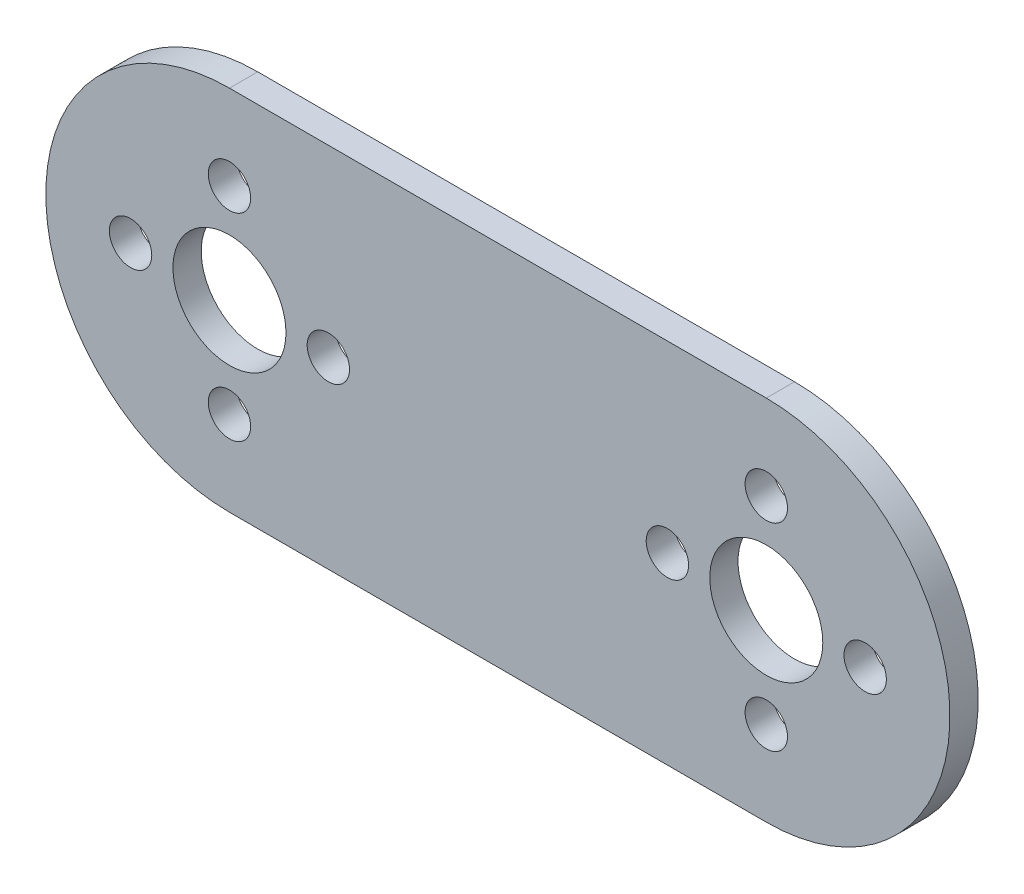
ISO-10303-21;
HEADER;
FILE_DESCRIPTION(('STEP AP214'),'2;1');
FILE_NAME('part.step','',(''),(''),'','','');
FILE_SCHEMA(('AUTOMOTIVE_DESIGN { 1 0 10303 214 1 1 1 1 }'));
ENDSEC;
DATA;
#1=APPLICATION_CONTEXT('core data for automotive mechanical design processes');
#2=APPLICATION_PROTOCOL_DEFINITION('international standard','automotive_design',2000,#1);
#3=PRODUCT_CONTEXT('',#1,'mechanical');
#4=PRODUCT('Part','Part','',(#3));
#5=PRODUCT_RELATED_PRODUCT_CATEGORY('part','',(#4));
#6=PRODUCT_DEFINITION_FORMATION('','',#4);
#7=PRODUCT_DEFINITION_CONTEXT('part definition',#1,'design');
#8=PRODUCT_DEFINITION('design','',#6,#7);
#9=PRODUCT_DEFINITION_SHAPE('','',#8);
#10=(LENGTH_UNIT() NAMED_UNIT(*) SI_UNIT(.MILLI.,.METRE.));
#11=(NAMED_UNIT(*) PLANE_ANGLE_UNIT() SI_UNIT($,.RADIAN.));
#12=(NAMED_UNIT(*) SI_UNIT($,.STERADIAN.) SOLID_ANGLE_UNIT());
#13=UNCERTAINTY_MEASURE_WITH_UNIT(LENGTH_MEASURE(1.E-05),#10,'distance_accuracy_value','');
#14=(GEOMETRIC_REPRESENTATION_CONTEXT(3) GLOBAL_UNCERTAINTY_ASSIGNED_CONTEXT((#13)) GLOBAL_UNIT_ASSIGNED_CONTEXT((#10,
#11,#12)) REPRESENTATION_CONTEXT('',''));
#15=CARTESIAN_POINT('',(0.,0.,0.));
#16=DIRECTION('',(0.,0.,1.));
#17=DIRECTION('',(1.,0.,0.));
#18=AXIS2_PLACEMENT_3D('',#15,#16,#17);
#19=CARTESIAN_POINT('',(19.,0.,2.));
#20=DIRECTION('',(0.,0.,-1.));
#21=DIRECTION('',(-1.,0.,0.));
#22=AXIS2_PLACEMENT_3D('',#19,#20,#21);
#23=PLANE('',#22);
#24=CARTESIAN_POINT('',(19.,0.,2.));
#25=DIRECTION('',(0.,0.,1.));
#26=DIRECTION('',(-1.,0.,0.));
#27=AXIS2_PLACEMENT_3D('',#24,#25,#26);
#28=CIRCLE('',#27,13.);
#29=CARTESIAN_POINT('',(19.,-13.,2.));
#30=VERTEX_POINT('',#29);
#31=CARTESIAN_POINT('',(19.,13.,2.));
#32=VERTEX_POINT('',#31);
#33=EDGE_CURVE('E92',#30,#32,#28,.T.);
#34=ORIENTED_EDGE('',*,*,#33,.T.);
#35=DIRECTION('',(-1.,0.,0.));
#36=VECTOR('',#35,1.);
#37=CARTESIAN_POINT('',(-19.,13.,2.));
#38=LINE('',#37,#36);
#39=CARTESIAN_POINT('',(-19.,13.,2.));
#40=VERTEX_POINT('',#39);
#41=EDGE_CURVE('E87',#32,#40,#38,.T.);
#42=ORIENTED_EDGE('',*,*,#41,.T.);
#43=CARTESIAN_POINT('',(-19.,0.,2.));
#44=DIRECTION('',(0.,0.,1.));
#45=DIRECTION('',(-1.,0.,0.));
#46=AXIS2_PLACEMENT_3D('',#43,#44,#45);
#47=CIRCLE('',#46,13.);
#48=CARTESIAN_POINT('',(-19.,-13.,2.));
#49=VERTEX_POINT('',#48);
#50=EDGE_CURVE('E90',#40,#49,#47,.T.);
#51=ORIENTED_EDGE('',*,*,#50,.T.);
#52=DIRECTION('',(1.,0.,0.));
#53=VECTOR('',#52,1.);
#54=CARTESIAN_POINT('',(-19.,-13.,2.));
#55=LINE('',#54,#53);
#56=EDGE_CURVE('E57',#49,#30,#55,.T.);
#57=ORIENTED_EDGE('',*,*,#56,.T.);
#58=EDGE_LOOP('',(#34,#42,#51,#57));
#59=FACE_BOUND('',#58,.T.);
#60=CARTESIAN_POINT('',(-19.,0.,2.));
#61=DIRECTION('',(0.,0.,1.));
#62=DIRECTION('',(1.,0.,0.));
#63=AXIS2_PLACEMENT_3D('',#60,#61,#62);
#64=CIRCLE('',#63,4.);
#65=CARTESIAN_POINT('',(-15.,0.,2.));
#66=VERTEX_POINT('',#65);
#67=EDGE_CURVE('E112',#66,#66,#64,.T.);
#68=ORIENTED_EDGE('',*,*,#67,.F.);
#69=EDGE_LOOP('',(#68));
#70=FACE_BOUND('',#69,.T.);
#71=CARTESIAN_POINT('',(19.,0.,2.));
#72=DIRECTION('',(0.,0.,1.));
#73=DIRECTION('',(1.,0.,0.));
#74=AXIS2_PLACEMENT_3D('',#71,#72,#73);
#75=CIRCLE('',#74,4.);
#76=CARTESIAN_POINT('',(23.,0.,2.));
#77=VERTEX_POINT('',#76);
#78=EDGE_CURVE('E134',#77,#77,#75,.T.);
#79=ORIENTED_EDGE('',*,*,#78,.F.);
#80=EDGE_LOOP('',(#79));
#81=FACE_BOUND('',#80,.T.);
#82=CARTESIAN_POINT('',(-19.,7.00000000000001,2.));
#83=DIRECTION('',(0.,0.,1.));
#84=DIRECTION('',(1.,0.,0.));
#85=AXIS2_PLACEMENT_3D('',#82,#83,#84);
#86=CIRCLE('',#85,1.5);
#87=CARTESIAN_POINT('',(-17.5,7.00000000000001,2.));
#88=VERTEX_POINT('',#87);
#89=EDGE_CURVE('E142',#88,#88,#86,.T.);
#90=ORIENTED_EDGE('',*,*,#89,.F.);
#91=EDGE_LOOP('',(#90));
#92=FACE_BOUND('',#91,.T.);
#93=CARTESIAN_POINT('',(19.,7.00000000000001,2.));
#94=DIRECTION('',(0.,0.,1.));
#95=DIRECTION('',(1.,0.,0.));
#96=AXIS2_PLACEMENT_3D('',#93,#94,#95);
#97=CIRCLE('',#96,1.5);
#98=CARTESIAN_POINT('',(20.5,7.00000000000001,2.));
#99=VERTEX_POINT('',#98);
#100=EDGE_CURVE('E150',#99,#99,#97,.T.);
#101=ORIENTED_EDGE('',*,*,#100,.F.);
#102=EDGE_LOOP('',(#101));
#103=FACE_BOUND('',#102,.T.);
#104=CARTESIAN_POINT('',(-11.9999999999999,0.,2.));
#105=DIRECTION('',(0.,0.,1.));
#106=DIRECTION('',(1.,0.,0.));
#107=AXIS2_PLACEMENT_3D('',#104,#105,#106);
#108=CIRCLE('',#107,1.5);
#109=CARTESIAN_POINT('',(-10.4999999999999,0.,2.));
#110=VERTEX_POINT('',#109);
#111=EDGE_CURVE('E158',#110,#110,#108,.T.);
#112=ORIENTED_EDGE('',*,*,#111,.F.);
#113=EDGE_LOOP('',(#112));
#114=FACE_BOUND('',#113,.T.);
#115=CARTESIAN_POINT('',(-18.9999999999999,-6.99999999999999,2.));
#116=DIRECTION('',(0.,0.,1.));
#117=DIRECTION('',(1.,0.,0.));
#118=AXIS2_PLACEMENT_3D('',#115,#116,#117);
#119=CIRCLE('',#118,1.5);
#120=CARTESIAN_POINT('',(-17.4999999999999,-6.99999999999999,2.));
#121=VERTEX_POINT('',#120);
#122=EDGE_CURVE('E166',#121,#121,#119,.T.);
#123=ORIENTED_EDGE('',*,*,#122,.F.);
#124=EDGE_LOOP('',(#123));
#125=FACE_BOUND('',#124,.T.);
#126=CARTESIAN_POINT('',(-25.9999999999999,0.,2.));
#127=DIRECTION('',(0.,0.,1.));
#128=DIRECTION('',(1.,0.,0.));
#129=AXIS2_PLACEMENT_3D('',#126,#127,#128);
#130=CIRCLE('',#129,1.5);
#131=CARTESIAN_POINT('',(-24.4999999999999,0.,2.));
#132=VERTEX_POINT('',#131);
#133=EDGE_CURVE('E174',#132,#132,#130,.T.);
#134=ORIENTED_EDGE('',*,*,#133,.F.);
#135=EDGE_LOOP('',(#134));
#136=FACE_BOUND('',#135,.T.);
#137=CARTESIAN_POINT('',(26.0000000000001,0.,2.));
#138=DIRECTION('',(0.,0.,1.));
#139=DIRECTION('',(1.,0.,0.));
#140=AXIS2_PLACEMENT_3D('',#137,#138,#139);
#141=CIRCLE('',#140,1.5);
#142=CARTESIAN_POINT('',(27.5000000000001,0.,2.));
#143=VERTEX_POINT('',#142);
#144=EDGE_CURVE('E182',#143,#143,#141,.T.);
#145=ORIENTED_EDGE('',*,*,#144,.F.);
#146=EDGE_LOOP('',(#145));
#147=FACE_BOUND('',#146,.T.);
#148=CARTESIAN_POINT('',(19.0000000000001,-6.99999999999999,2.));
#149=DIRECTION('',(0.,0.,1.));
#150=DIRECTION('',(1.,0.,0.));
#151=AXIS2_PLACEMENT_3D('',#148,#149,#150);
#152=CIRCLE('',#151,1.5);
#153=CARTESIAN_POINT('',(20.5000000000001,-6.99999999999999,2.));
#154=VERTEX_POINT('',#153);
#155=EDGE_CURVE('E190',#154,#154,#152,.T.);
#156=ORIENTED_EDGE('',*,*,#155,.F.);
#157=EDGE_LOOP('',(#156));
#158=FACE_BOUND('',#157,.T.);
#159=CARTESIAN_POINT('',(12.0000000000001,0.,2.));
#160=DIRECTION('',(0.,0.,1.));
#161=DIRECTION('',(1.,0.,0.));
#162=AXIS2_PLACEMENT_3D('',#159,#160,#161);
#163=CIRCLE('',#162,1.5);
#164=CARTESIAN_POINT('',(13.5000000000001,0.,2.));
#165=VERTEX_POINT('',#164);
#166=EDGE_CURVE('E198',#165,#165,#163,.T.);
#167=ORIENTED_EDGE('',*,*,#166,.F.);
#168=EDGE_LOOP('',(#167));
#169=FACE_BOUND('',#168,.T.);
#170=ADVANCED_FACE('F39',(#59,#70,#81,#92,#103,#114,#125,#136,#147,#158,#169),#23,.F.);
#171=CARTESIAN_POINT('',(19.,0.,0.));
#172=DIRECTION('',(0.,0.,-1.));
#173=DIRECTION('',(-1.,0.,0.));
#174=AXIS2_PLACEMENT_3D('',#171,#172,#173);
#175=PLANE('',#174);
#176=CARTESIAN_POINT('',(19.0000000000001,-6.99999999999999,0.));
#177=DIRECTION('',(0.,0.,1.));
#178=DIRECTION('',(1.,0.,0.));
#179=AXIS2_PLACEMENT_3D('',#176,#177,#178);
#180=CIRCLE('',#179,1.5);
#181=CARTESIAN_POINT('',(20.5000000000001,-6.99999999999999,0.));
#182=VERTEX_POINT('',#181);
#183=EDGE_CURVE('E194',#182,#182,#180,.T.);
#184=ORIENTED_EDGE('',*,*,#183,.T.);
#185=EDGE_LOOP('',(#184));
#186=FACE_BOUND('',#185,.T.);
#187=CARTESIAN_POINT('',(-25.9999999999999,0.,0.));
#188=DIRECTION('',(0.,0.,1.));
#189=DIRECTION('',(1.,0.,0.));
#190=AXIS2_PLACEMENT_3D('',#187,#188,#189);
#191=CIRCLE('',#190,1.5);
#192=CARTESIAN_POINT('',(-24.4999999999999,0.,0.));
#193=VERTEX_POINT('',#192);
#194=EDGE_CURVE('E178',#193,#193,#191,.T.);
#195=ORIENTED_EDGE('',*,*,#194,.T.);
#196=EDGE_LOOP('',(#195));
#197=FACE_BOUND('',#196,.T.);
#198=CARTESIAN_POINT('',(-11.9999999999999,0.,0.));
#199=DIRECTION('',(0.,0.,1.));
#200=DIRECTION('',(1.,0.,0.));
#201=AXIS2_PLACEMENT_3D('',#198,#199,#200);
#202=CIRCLE('',#201,1.5);
#203=CARTESIAN_POINT('',(-10.4999999999999,0.,0.));
#204=VERTEX_POINT('',#203);
#205=EDGE_CURVE('E162',#204,#204,#202,.T.);
#206=ORIENTED_EDGE('',*,*,#205,.T.);
#207=EDGE_LOOP('',(#206));
#208=FACE_BOUND('',#207,.T.);
#209=CARTESIAN_POINT('',(-19.,7.00000000000001,0.));
#210=DIRECTION('',(0.,0.,1.));
#211=DIRECTION('',(1.,0.,0.));
#212=AXIS2_PLACEMENT_3D('',#209,#210,#211);
#213=CIRCLE('',#212,1.5);
#214=CARTESIAN_POINT('',(-17.5,7.00000000000001,0.));
#215=VERTEX_POINT('',#214);
#216=EDGE_CURVE('E146',#215,#215,#213,.T.);
#217=ORIENTED_EDGE('',*,*,#216,.T.);
#218=EDGE_LOOP('',(#217));
#219=FACE_BOUND('',#218,.T.);
#220=CARTESIAN_POINT('',(-19.,0.,0.));
#221=DIRECTION('',(0.,0.,1.));
#222=DIRECTION('',(1.,0.,0.));
#223=AXIS2_PLACEMENT_3D('',#220,#221,#222);
#224=CIRCLE('',#223,4.);
#225=CARTESIAN_POINT('',(-15.,0.,0.));
#226=VERTEX_POINT('',#225);
#227=EDGE_CURVE('E130',#226,#226,#224,.T.);
#228=ORIENTED_EDGE('',*,*,#227,.T.);
#229=EDGE_LOOP('',(#228));
#230=FACE_BOUND('',#229,.T.);
#231=CARTESIAN_POINT('',(19.,0.,0.));
#232=DIRECTION('',(0.,0.,1.));
#233=DIRECTION('',(-1.,0.,0.));
#234=AXIS2_PLACEMENT_3D('',#231,#232,#233);
#235=CIRCLE('',#234,13.);
#236=CARTESIAN_POINT('',(19.,-13.,0.));
#237=VERTEX_POINT('',#236);
#238=CARTESIAN_POINT('',(19.,13.,0.));
#239=VERTEX_POINT('',#238);
#240=EDGE_CURVE('E108',#237,#239,#235,.T.);
#241=ORIENTED_EDGE('',*,*,#240,.F.);
#242=DIRECTION('',(1.,0.,0.));
#243=VECTOR('',#242,1.);
#244=CARTESIAN_POINT('',(-19.,-13.,0.));
#245=LINE('',#244,#243);
#246=CARTESIAN_POINT('',(-19.,-13.,0.));
#247=VERTEX_POINT('',#246);
#248=EDGE_CURVE('E80',#247,#237,#245,.T.);
#249=ORIENTED_EDGE('',*,*,#248,.F.);
#250=CARTESIAN_POINT('',(-19.,0.,0.));
#251=DIRECTION('',(0.,0.,1.));
#252=DIRECTION('',(-1.,0.,0.));
#253=AXIS2_PLACEMENT_3D('',#250,#251,#252);
#254=CIRCLE('',#253,13.);
#255=CARTESIAN_POINT('',(-19.,13.,0.));
#256=VERTEX_POINT('',#255);
#257=EDGE_CURVE('E74',#256,#247,#254,.T.);
#258=ORIENTED_EDGE('',*,*,#257,.F.);
#259=DIRECTION('',(-1.,0.,0.));
#260=VECTOR('',#259,1.);
#261=CARTESIAN_POINT('',(-19.,13.,0.));
#262=LINE('',#261,#260);
#263=EDGE_CURVE('E97',#239,#256,#262,.T.);
#264=ORIENTED_EDGE('',*,*,#263,.F.);
#265=EDGE_LOOP('',(#241,#249,#258,#264));
#266=FACE_BOUND('',#265,.T.);
#267=CARTESIAN_POINT('',(19.,0.,0.));
#268=DIRECTION('',(0.,0.,1.));
#269=DIRECTION('',(1.,0.,0.));
#270=AXIS2_PLACEMENT_3D('',#267,#268,#269);
#271=CIRCLE('',#270,4.);
#272=CARTESIAN_POINT('',(23.,0.,0.));
#273=VERTEX_POINT('',#272);
#274=EDGE_CURVE('E138',#273,#273,#271,.T.);
#275=ORIENTED_EDGE('',*,*,#274,.T.);
#276=EDGE_LOOP('',(#275));
#277=FACE_BOUND('',#276,.T.);
#278=CARTESIAN_POINT('',(19.,7.00000000000001,0.));
#279=DIRECTION('',(0.,0.,1.));
#280=DIRECTION('',(1.,0.,0.));
#281=AXIS2_PLACEMENT_3D('',#278,#279,#280);
#282=CIRCLE('',#281,1.5);
#283=CARTESIAN_POINT('',(20.5,7.00000000000001,0.));
#284=VERTEX_POINT('',#283);
#285=EDGE_CURVE('E154',#284,#284,#282,.T.);
#286=ORIENTED_EDGE('',*,*,#285,.T.);
#287=EDGE_LOOP('',(#286));
#288=FACE_BOUND('',#287,.T.);
#289=CARTESIAN_POINT('',(-18.9999999999999,-6.99999999999999,0.));
#290=DIRECTION('',(0.,0.,1.));
#291=DIRECTION('',(1.,0.,0.));
#292=AXIS2_PLACEMENT_3D('',#289,#290,#291);
#293=CIRCLE('',#292,1.5);
#294=CARTESIAN_POINT('',(-17.4999999999999,-6.99999999999999,0.));
#295=VERTEX_POINT('',#294);
#296=EDGE_CURVE('E170',#295,#295,#293,.T.);
#297=ORIENTED_EDGE('',*,*,#296,.T.);
#298=EDGE_LOOP('',(#297));
#299=FACE_BOUND('',#298,.T.);
#300=CARTESIAN_POINT('',(26.0000000000001,0.,0.));
#301=DIRECTION('',(0.,0.,1.));
#302=DIRECTION('',(1.,0.,0.));
#303=AXIS2_PLACEMENT_3D('',#300,#301,#302);
#304=CIRCLE('',#303,1.5);
#305=CARTESIAN_POINT('',(27.5000000000001,0.,0.));
#306=VERTEX_POINT('',#305);
#307=EDGE_CURVE('E186',#306,#306,#304,.T.);
#308=ORIENTED_EDGE('',*,*,#307,.T.);
#309=EDGE_LOOP('',(#308));
#310=FACE_BOUND('',#309,.T.);
#311=CARTESIAN_POINT('',(12.0000000000001,0.,0.));
#312=DIRECTION('',(0.,0.,1.));
#313=DIRECTION('',(1.,0.,0.));
#314=AXIS2_PLACEMENT_3D('',#311,#312,#313);
#315=CIRCLE('',#314,1.5);
#316=CARTESIAN_POINT('',(13.5000000000001,0.,0.));
#317=VERTEX_POINT('',#316);
#318=EDGE_CURVE('E202',#317,#317,#315,.T.);
#319=ORIENTED_EDGE('',*,*,#318,.T.);
#320=EDGE_LOOP('',(#319));
#321=FACE_BOUND('',#320,.T.);
#322=ADVANCED_FACE('F125',(#186,#197,#208,#219,#230,#266,#277,#288,#299,#310,#321),#175,.T.);
#323=CARTESIAN_POINT('',(19.,0.,2.));
#324=DIRECTION('',(0.,0.,-1.));
#325=DIRECTION('',(-1.,0.,0.));
#326=AXIS2_PLACEMENT_3D('',#323,#324,#325);
#327=CYLINDRICAL_SURFACE('',#326,13.);
#328=ORIENTED_EDGE('',*,*,#240,.T.);
#329=DIRECTION('',(0.,0.,-1.));
#330=VECTOR('',#329,1.);
#331=CARTESIAN_POINT('',(19.,13.,2.));
#332=LINE('',#331,#330);
#333=EDGE_CURVE('E11',#32,#239,#332,.T.);
#334=ORIENTED_EDGE('',*,*,#333,.F.);
#335=ORIENTED_EDGE('',*,*,#33,.F.);
#336=DIRECTION('',(0.,0.,-1.));
#337=VECTOR('',#336,1.);
#338=CARTESIAN_POINT('',(19.,-13.,2.));
#339=LINE('',#338,#337);
#340=EDGE_CURVE('E104',#30,#237,#339,.T.);
#341=ORIENTED_EDGE('',*,*,#340,.T.);
#342=EDGE_LOOP('',(#328,#334,#335,#341));
#343=FACE_BOUND('',#342,.T.);
#344=ADVANCED_FACE('F41',(#343),#327,.T.);
#345=CARTESIAN_POINT('',(-19.,13.,2.));
#346=DIRECTION('',(0.,-1.,0.));
#347=DIRECTION('',(0.,0.,-1.));
#348=AXIS2_PLACEMENT_3D('',#345,#346,#347);
#349=PLANE('',#348);
#350=ORIENTED_EDGE('',*,*,#263,.T.);
#351=DIRECTION('',(0.,0.,-1.));
#352=VECTOR('',#351,1.);
#353=CARTESIAN_POINT('',(-19.,13.,2.));
#354=LINE('',#353,#352);
#355=EDGE_CURVE('E49',#40,#256,#354,.T.);
#356=ORIENTED_EDGE('',*,*,#355,.F.);
#357=ORIENTED_EDGE('',*,*,#41,.F.);
#358=ORIENTED_EDGE('',*,*,#333,.T.);
#359=EDGE_LOOP('',(#350,#356,#357,#358));
#360=FACE_BOUND('',#359,.T.);
#361=ADVANCED_FACE('F96',(#360),#349,.F.);
#362=CARTESIAN_POINT('',(-19.,0.,2.));
#363=DIRECTION('',(0.,0.,-1.));
#364=DIRECTION('',(-1.,0.,0.));
#365=AXIS2_PLACEMENT_3D('',#362,#363,#364);
#366=CYLINDRICAL_SURFACE('',#365,13.);
#367=ORIENTED_EDGE('',*,*,#257,.T.);
#368=DIRECTION('',(0.,0.,-1.));
#369=VECTOR('',#368,1.);
#370=CARTESIAN_POINT('',(-19.,-13.,2.));
#371=LINE('',#370,#369);
#372=EDGE_CURVE('E99',#49,#247,#371,.T.);
#373=ORIENTED_EDGE('',*,*,#372,.F.);
#374=ORIENTED_EDGE('',*,*,#50,.F.);
#375=ORIENTED_EDGE('',*,*,#355,.T.);
#376=EDGE_LOOP('',(#367,#373,#374,#375));
#377=FACE_BOUND('',#376,.T.);
#378=ADVANCED_FACE('F100',(#377),#366,.T.);
#379=CARTESIAN_POINT('',(-19.,-13.,2.));
#380=DIRECTION('',(0.,1.,0.));
#381=DIRECTION('',(0.,0.,1.));
#382=AXIS2_PLACEMENT_3D('',#379,#380,#381);
#383=PLANE('',#382);
#384=ORIENTED_EDGE('',*,*,#248,.T.);
#385=ORIENTED_EDGE('',*,*,#340,.F.);
#386=ORIENTED_EDGE('',*,*,#56,.F.);
#387=ORIENTED_EDGE('',*,*,#372,.T.);
#388=EDGE_LOOP('',(#384,#385,#386,#387));
#389=FACE_BOUND('',#388,.T.);
#390=ADVANCED_FACE('F122',(#389),#383,.F.);
#391=CARTESIAN_POINT('',(-19.,0.,2.));
#392=DIRECTION('',(0.,0.,-1.));
#393=DIRECTION('',(-1.,0.,0.));
#394=AXIS2_PLACEMENT_3D('',#391,#392,#393);
#395=CYLINDRICAL_SURFACE('',#394,4.);
#396=ORIENTED_EDGE('',*,*,#67,.T.);
#397=EDGE_LOOP('',(#396));
#398=FACE_BOUND('',#397,.T.);
#399=ORIENTED_EDGE('',*,*,#227,.F.);
#400=EDGE_LOOP('',(#399));
#401=FACE_BOUND('',#400,.T.);
#402=ADVANCED_FACE('F221',(#398,#401),#395,.F.);
#403=CARTESIAN_POINT('',(19.,0.,2.));
#404=DIRECTION('',(0.,0.,-1.));
#405=DIRECTION('',(-1.,0.,0.));
#406=AXIS2_PLACEMENT_3D('',#403,#404,#405);
#407=CYLINDRICAL_SURFACE('',#406,4.);
#408=ORIENTED_EDGE('',*,*,#78,.T.);
#409=EDGE_LOOP('',(#408));
#410=FACE_BOUND('',#409,.T.);
#411=ORIENTED_EDGE('',*,*,#274,.F.);
#412=EDGE_LOOP('',(#411));
#413=FACE_BOUND('',#412,.T.);
#414=ADVANCED_FACE('F267',(#410,#413),#407,.F.);
#415=CARTESIAN_POINT('',(-19.,7.00000000000001,2.));
#416=DIRECTION('',(0.,0.,-1.));
#417=DIRECTION('',(-1.,0.,0.));
#418=AXIS2_PLACEMENT_3D('',#415,#416,#417);
#419=CYLINDRICAL_SURFACE('',#418,1.5);
#420=ORIENTED_EDGE('',*,*,#89,.T.);
#421=EDGE_LOOP('',(#420));
#422=FACE_BOUND('',#421,.T.);
#423=ORIENTED_EDGE('',*,*,#216,.F.);
#424=EDGE_LOOP('',(#423));
#425=FACE_BOUND('',#424,.T.);
#426=ADVANCED_FACE('F275',(#422,#425),#419,.F.);
#427=CARTESIAN_POINT('',(19.,7.00000000000001,2.));
#428=DIRECTION('',(0.,0.,-1.));
#429=DIRECTION('',(-1.,0.,0.));
#430=AXIS2_PLACEMENT_3D('',#427,#428,#429);
#431=CYLINDRICAL_SURFACE('',#430,1.5);
#432=ORIENTED_EDGE('',*,*,#100,.T.);
#433=EDGE_LOOP('',(#432));
#434=FACE_BOUND('',#433,.T.);
#435=ORIENTED_EDGE('',*,*,#285,.F.);
#436=EDGE_LOOP('',(#435));
#437=FACE_BOUND('',#436,.T.);
#438=ADVANCED_FACE('F283',(#434,#437),#431,.F.);
#439=CARTESIAN_POINT('',(-11.9999999999999,0.,2.));
#440=DIRECTION('',(0.,0.,-1.));
#441=DIRECTION('',(-1.,0.,0.));
#442=AXIS2_PLACEMENT_3D('',#439,#440,#441);
#443=CYLINDRICAL_SURFACE('',#442,1.5);
#444=ORIENTED_EDGE('',*,*,#111,.T.);
#445=EDGE_LOOP('',(#444));
#446=FACE_BOUND('',#445,.T.);
#447=ORIENTED_EDGE('',*,*,#205,.F.);
#448=EDGE_LOOP('',(#447));
#449=FACE_BOUND('',#448,.T.);
#450=ADVANCED_FACE('F292',(#446,#449),#443,.F.);
#451=CARTESIAN_POINT('',(-18.9999999999999,-6.99999999999999,2.));
#452=DIRECTION('',(0.,0.,-1.));
#453=DIRECTION('',(-1.,0.,0.));
#454=AXIS2_PLACEMENT_3D('',#451,#452,#453);
#455=CYLINDRICAL_SURFACE('',#454,1.5);
#456=ORIENTED_EDGE('',*,*,#122,.T.);
#457=EDGE_LOOP('',(#456));
#458=FACE_BOUND('',#457,.T.);
#459=ORIENTED_EDGE('',*,*,#296,.F.);
#460=EDGE_LOOP('',(#459));
#461=FACE_BOUND('',#460,.T.);
#462=ADVANCED_FACE('F301',(#458,#461),#455,.F.);
#463=CARTESIAN_POINT('',(-25.9999999999999,0.,2.));
#464=DIRECTION('',(0.,0.,-1.));
#465=DIRECTION('',(-1.,0.,0.));
#466=AXIS2_PLACEMENT_3D('',#463,#464,#465);
#467=CYLINDRICAL_SURFACE('',#466,1.5);
#468=ORIENTED_EDGE('',*,*,#133,.T.);
#469=EDGE_LOOP('',(#468));
#470=FACE_BOUND('',#469,.T.);
#471=ORIENTED_EDGE('',*,*,#194,.F.);
#472=EDGE_LOOP('',(#471));
#473=FACE_BOUND('',#472,.T.);
#474=ADVANCED_FACE('F310',(#470,#473),#467,.F.);
#475=CARTESIAN_POINT('',(26.0000000000001,0.,2.));
#476=DIRECTION('',(0.,0.,-1.));
#477=DIRECTION('',(-1.,0.,0.));
#478=AXIS2_PLACEMENT_3D('',#475,#476,#477);
#479=CYLINDRICAL_SURFACE('',#478,1.5);
#480=ORIENTED_EDGE('',*,*,#144,.T.);
#481=EDGE_LOOP('',(#480));
#482=FACE_BOUND('',#481,.T.);
#483=ORIENTED_EDGE('',*,*,#307,.F.);
#484=EDGE_LOOP('',(#483));
#485=FACE_BOUND('',#484,.T.);
#486=ADVANCED_FACE('F319',(#482,#485),#479,.F.);
#487=CARTESIAN_POINT('',(19.0000000000001,-6.99999999999999,2.));
#488=DIRECTION('',(0.,0.,-1.));
#489=DIRECTION('',(-1.,0.,0.));
#490=AXIS2_PLACEMENT_3D('',#487,#488,#489);
#491=CYLINDRICAL_SURFACE('',#490,1.5);
#492=ORIENTED_EDGE('',*,*,#155,.T.);
#493=EDGE_LOOP('',(#492));
#494=FACE_BOUND('',#493,.T.);
#495=ORIENTED_EDGE('',*,*,#183,.F.);
#496=EDGE_LOOP('',(#495));
#497=FACE_BOUND('',#496,.T.);
#498=ADVANCED_FACE('F328',(#494,#497),#491,.F.);
#499=CARTESIAN_POINT('',(12.0000000000001,0.,2.));
#500=DIRECTION('',(0.,0.,-1.));
#501=DIRECTION('',(-1.,0.,0.));
#502=AXIS2_PLACEMENT_3D('',#499,#500,#501);
#503=CYLINDRICAL_SURFACE('',#502,1.5);
#504=ORIENTED_EDGE('',*,*,#166,.T.);
#505=EDGE_LOOP('',(#504));
#506=FACE_BOUND('',#505,.T.);
#507=ORIENTED_EDGE('',*,*,#318,.F.);
#508=EDGE_LOOP('',(#507));
#509=FACE_BOUND('',#508,.T.);
#510=ADVANCED_FACE('F210',(#506,#509),#503,.F.);
#511=CLOSED_SHELL('',(#170,#322,#344,#361,#378,#390,#402,#414,#426,#438,#450,#462,#474,#486,
#498,#510));
#512=MANIFOLD_SOLID_BREP('B2',#511);
#513=ADVANCED_BREP_SHAPE_REPRESENTATION('',(#18,#512),#14);
#514=SHAPE_DEFINITION_REPRESENTATION(#9,#513);
ENDSEC;
END-ISO-10303-21;
